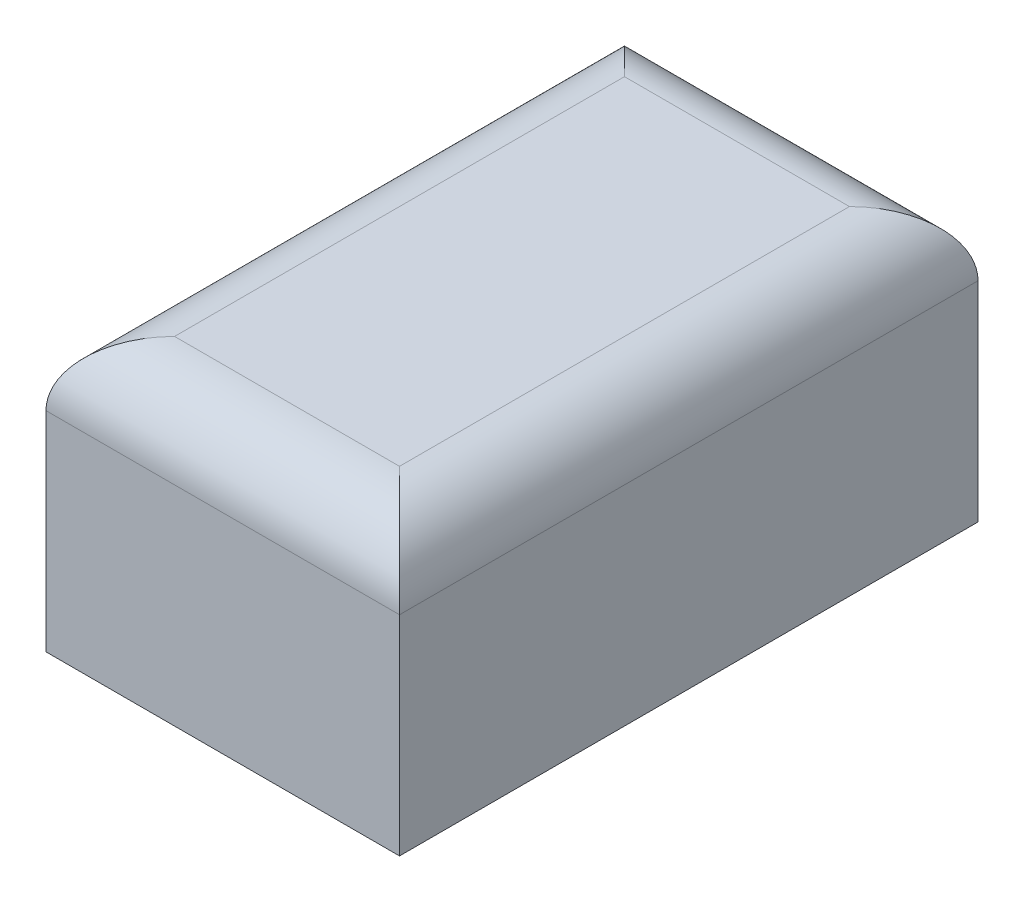
ISO-10303-21;
HEADER;
FILE_DESCRIPTION(('STEP AP214'),'2;1');
FILE_NAME('part.step','',(''),(''),'','','');
FILE_SCHEMA(('AUTOMOTIVE_DESIGN { 1 0 10303 214 1 1 1 1 }'));
ENDSEC;
DATA;
#1=APPLICATION_CONTEXT('core data for automotive mechanical design processes');
#2=APPLICATION_PROTOCOL_DEFINITION('international standard','automotive_design',2000,#1);
#3=PRODUCT_CONTEXT('',#1,'mechanical');
#4=PRODUCT('Part','Part','',(#3));
#5=PRODUCT_RELATED_PRODUCT_CATEGORY('part','',(#4));
#6=PRODUCT_DEFINITION_FORMATION('','',#4);
#7=PRODUCT_DEFINITION_CONTEXT('part definition',#1,'design');
#8=PRODUCT_DEFINITION('design','',#6,#7);
#9=PRODUCT_DEFINITION_SHAPE('','',#8);
#10=(LENGTH_UNIT() NAMED_UNIT(*) SI_UNIT(.MILLI.,.METRE.));
#11=(NAMED_UNIT(*) PLANE_ANGLE_UNIT() SI_UNIT($,.RADIAN.));
#12=(NAMED_UNIT(*) SI_UNIT($,.STERADIAN.) SOLID_ANGLE_UNIT());
#13=UNCERTAINTY_MEASURE_WITH_UNIT(LENGTH_MEASURE(1.E-05),#10,'distance_accuracy_value','');
#14=(GEOMETRIC_REPRESENTATION_CONTEXT(3) GLOBAL_UNCERTAINTY_ASSIGNED_CONTEXT((#13)) GLOBAL_UNIT_ASSIGNED_CONTEXT((#10,
#11,#12)) REPRESENTATION_CONTEXT('',''));
#15=CARTESIAN_POINT('',(0.,0.,0.));
#16=DIRECTION('',(0.,0.,1.));
#17=DIRECTION('',(1.,0.,0.));
#18=AXIS2_PLACEMENT_3D('',#15,#16,#17);
#19=CARTESIAN_POINT('',(11.,17.,18.));
#20=DIRECTION('',(-1.,0.,0.));
#21=DIRECTION('',(0.,0.,1.));
#22=AXIS2_PLACEMENT_3D('',#19,#20,#21);
#23=PLANE('',#22);
#24=DIRECTION('',(0.,-1.,0.));
#25=VECTOR('',#24,1.);
#26=CARTESIAN_POINT('',(11.,17.,-18.));
#27=LINE('',#26,#25);
#28=CARTESIAN_POINT('',(11.,13.,-18.));
#29=VERTEX_POINT('',#28);
#30=CARTESIAN_POINT('',(11.,0.,-18.));
#31=VERTEX_POINT('',#30);
#32=EDGE_CURVE('E171',#29,#31,#27,.T.);
#33=ORIENTED_EDGE('',*,*,#32,.F.);
#34=DIRECTION('',(0.,0.,-1.));
#35=VECTOR('',#34,1.);
#36=CARTESIAN_POINT('',(11.,13.,18.));
#37=LINE('',#36,#35);
#38=CARTESIAN_POINT('',(11.,13.,18.));
#39=VERTEX_POINT('',#38);
#40=EDGE_CURVE('E57',#29,#39,#37,.F.);
#41=ORIENTED_EDGE('',*,*,#40,.T.);
#42=DIRECTION('',(0.,-1.,0.));
#43=VECTOR('',#42,1.);
#44=CARTESIAN_POINT('',(11.,17.,18.));
#45=LINE('',#44,#43);
#46=CARTESIAN_POINT('',(11.,0.,18.));
#47=VERTEX_POINT('',#46);
#48=EDGE_CURVE('E165',#39,#47,#45,.T.);
#49=ORIENTED_EDGE('',*,*,#48,.T.);
#50=DIRECTION('',(0.,0.,-1.));
#51=VECTOR('',#50,1.);
#52=CARTESIAN_POINT('',(11.,0.,18.));
#53=LINE('',#52,#51);
#54=EDGE_CURVE('E150',#47,#31,#53,.T.);
#55=ORIENTED_EDGE('',*,*,#54,.T.);
#56=EDGE_LOOP('',(#33,#41,#49,#55));
#57=FACE_BOUND('',#56,.T.);
#58=ADVANCED_FACE('F33',(#57),#23,.F.);
#59=CARTESIAN_POINT('',(-11.,17.,-18.));
#60=DIRECTION('',(0.,0.,1.));
#61=DIRECTION('',(1.,0.,0.));
#62=AXIS2_PLACEMENT_3D('',#59,#60,#61);
#63=PLANE('',#62);
#64=DIRECTION('',(0.,-1.,0.));
#65=VECTOR('',#64,1.);
#66=CARTESIAN_POINT('',(-11.,17.,-18.));
#67=LINE('',#66,#65);
#68=CARTESIAN_POINT('',(-11.,13.,-18.));
#69=VERTEX_POINT('',#68);
#70=CARTESIAN_POINT('',(-11.,0.,-18.));
#71=VERTEX_POINT('',#70);
#72=EDGE_CURVE('E169',#69,#71,#67,.T.);
#73=ORIENTED_EDGE('',*,*,#72,.F.);
#74=DIRECTION('',(-1.,0.,0.));
#75=VECTOR('',#74,1.);
#76=CARTESIAN_POINT('',(-11.,13.,-18.));
#77=LINE('',#76,#75);
#78=EDGE_CURVE('E182',#69,#29,#77,.F.);
#79=ORIENTED_EDGE('',*,*,#78,.T.);
#80=ORIENTED_EDGE('',*,*,#32,.T.);
#81=DIRECTION('',(-1.,0.,0.));
#82=VECTOR('',#81,1.);
#83=CARTESIAN_POINT('',(-11.,0.,-18.));
#84=LINE('',#83,#82);
#85=EDGE_CURVE('E156',#31,#71,#84,.T.);
#86=ORIENTED_EDGE('',*,*,#85,.T.);
#87=EDGE_LOOP('',(#73,#79,#80,#86));
#88=FACE_BOUND('',#87,.T.);
#89=ADVANCED_FACE('F211',(#88),#63,.F.);
#90=CARTESIAN_POINT('',(-11.,17.,18.));
#91=DIRECTION('',(1.,0.,0.));
#92=DIRECTION('',(0.,0.,-1.));
#93=AXIS2_PLACEMENT_3D('',#90,#91,#92);
#94=PLANE('',#93);
#95=DIRECTION('',(0.,-1.,0.));
#96=VECTOR('',#95,1.);
#97=CARTESIAN_POINT('',(-11.,17.,18.));
#98=LINE('',#97,#96);
#99=CARTESIAN_POINT('',(-11.,13.,18.));
#100=VERTEX_POINT('',#99);
#101=CARTESIAN_POINT('',(-11.,0.,18.));
#102=VERTEX_POINT('',#101);
#103=EDGE_CURVE('E167',#100,#102,#98,.T.);
#104=ORIENTED_EDGE('',*,*,#103,.F.);
#105=DIRECTION('',(0.,0.,1.));
#106=VECTOR('',#105,1.);
#107=CARTESIAN_POINT('',(-11.,13.,18.));
#108=LINE('',#107,#106);
#109=EDGE_CURVE('E11',#100,#69,#108,.F.);
#110=ORIENTED_EDGE('',*,*,#109,.T.);
#111=ORIENTED_EDGE('',*,*,#72,.T.);
#112=DIRECTION('',(0.,0.,1.));
#113=VECTOR('',#112,1.);
#114=CARTESIAN_POINT('',(-11.,0.,18.));
#115=LINE('',#114,#113);
#116=EDGE_CURVE('E159',#71,#102,#115,.T.);
#117=ORIENTED_EDGE('',*,*,#116,.T.);
#118=EDGE_LOOP('',(#104,#110,#111,#117));
#119=FACE_BOUND('',#118,.T.);
#120=ADVANCED_FACE('F208',(#119),#94,.F.);
#121=CARTESIAN_POINT('',(-11.,17.,18.));
#122=DIRECTION('',(0.,0.,-1.));
#123=DIRECTION('',(-1.,0.,0.));
#124=AXIS2_PLACEMENT_3D('',#121,#122,#123);
#125=PLANE('',#124);
#126=ORIENTED_EDGE('',*,*,#48,.F.);
#127=DIRECTION('',(1.,0.,0.));
#128=VECTOR('',#127,1.);
#129=CARTESIAN_POINT('',(-11.,13.,18.));
#130=LINE('',#129,#128);
#131=EDGE_CURVE('E42',#39,#100,#130,.F.);
#132=ORIENTED_EDGE('',*,*,#131,.T.);
#133=ORIENTED_EDGE('',*,*,#103,.T.);
#134=DIRECTION('',(1.,0.,0.));
#135=VECTOR('',#134,1.);
#136=CARTESIAN_POINT('',(-11.,0.,18.));
#137=LINE('',#136,#135);
#138=EDGE_CURVE('E162',#102,#47,#137,.T.);
#139=ORIENTED_EDGE('',*,*,#138,.T.);
#140=EDGE_LOOP('',(#126,#132,#133,#139));
#141=FACE_BOUND('',#140,.T.);
#142=ADVANCED_FACE('F221',(#141),#125,.F.);
#143=CARTESIAN_POINT('',(0.,17.,0.));
#144=DIRECTION('',(0.,-1.,0.));
#145=DIRECTION('',(0.,0.,-1.));
#146=AXIS2_PLACEMENT_3D('',#143,#144,#145);
#147=PLANE('',#146);
#148=DIRECTION('',(0.,0.,-1.));
#149=VECTOR('',#148,1.);
#150=CARTESIAN_POINT('',(7.,17.,0.));
#151=LINE('',#150,#149);
#152=CARTESIAN_POINT('',(7.,17.,14.));
#153=VERTEX_POINT('',#152);
#154=CARTESIAN_POINT('',(7.,17.,-14.));
#155=VERTEX_POINT('',#154);
#156=EDGE_CURVE('E177',#153,#155,#151,.T.);
#157=ORIENTED_EDGE('',*,*,#156,.T.);
#158=DIRECTION('',(-1.,0.,0.));
#159=VECTOR('',#158,1.);
#160=CARTESIAN_POINT('',(0.,17.,-14.));
#161=LINE('',#160,#159);
#162=CARTESIAN_POINT('',(-7.,17.,-14.));
#163=VERTEX_POINT('',#162);
#164=EDGE_CURVE('E179',#155,#163,#161,.T.);
#165=ORIENTED_EDGE('',*,*,#164,.T.);
#166=DIRECTION('',(0.,0.,1.));
#167=VECTOR('',#166,1.);
#168=CARTESIAN_POINT('',(-7.,17.,0.));
#169=LINE('',#168,#167);
#170=CARTESIAN_POINT('',(-7.,17.,14.));
#171=VERTEX_POINT('',#170);
#172=EDGE_CURVE('E173',#163,#171,#169,.T.);
#173=ORIENTED_EDGE('',*,*,#172,.T.);
#174=DIRECTION('',(1.,0.,0.));
#175=VECTOR('',#174,1.);
#176=CARTESIAN_POINT('',(0.,17.,14.));
#177=LINE('',#176,#175);
#178=EDGE_CURVE('E175',#171,#153,#177,.T.);
#179=ORIENTED_EDGE('',*,*,#178,.T.);
#180=EDGE_LOOP('',(#157,#165,#173,#179));
#181=FACE_BOUND('',#180,.T.);
#182=ADVANCED_FACE('F218',(#181),#147,.F.);
#183=CARTESIAN_POINT('',(0.,0.,0.));
#184=DIRECTION('',(0.,-1.,0.));
#185=DIRECTION('',(0.,0.,-1.));
#186=AXIS2_PLACEMENT_3D('',#183,#184,#185);
#187=PLANE('',#186);
#188=DIRECTION('',(0.,0.,1.));
#189=VECTOR('',#188,1.);
#190=CARTESIAN_POINT('',(8.00000000000002,0.,-15.));
#191=LINE('',#190,#189);
#192=CARTESIAN_POINT('',(8.00000000000002,0.,-15.));
#193=VERTEX_POINT('',#192);
#194=CARTESIAN_POINT('',(8.00000000000002,0.,15.));
#195=VERTEX_POINT('',#194);
#196=EDGE_CURVE('E118',#193,#195,#191,.T.);
#197=ORIENTED_EDGE('',*,*,#196,.F.);
#198=DIRECTION('',(1.,0.,0.));
#199=VECTOR('',#198,1.);
#200=CARTESIAN_POINT('',(-7.99999999999999,0.,-15.));
#201=LINE('',#200,#199);
#202=CARTESIAN_POINT('',(-7.99999999999999,0.,-15.));
#203=VERTEX_POINT('',#202);
#204=EDGE_CURVE('E135',#203,#193,#201,.T.);
#205=ORIENTED_EDGE('',*,*,#204,.F.);
#206=DIRECTION('',(0.,0.,-1.));
#207=VECTOR('',#206,1.);
#208=CARTESIAN_POINT('',(-7.99999999999999,0.,-15.));
#209=LINE('',#208,#207);
#210=CARTESIAN_POINT('',(-7.99999999999999,0.,15.));
#211=VERTEX_POINT('',#210);
#212=EDGE_CURVE('E138',#211,#203,#209,.T.);
#213=ORIENTED_EDGE('',*,*,#212,.F.);
#214=DIRECTION('',(-1.,0.,0.));
#215=VECTOR('',#214,1.);
#216=CARTESIAN_POINT('',(-7.99999999999999,0.,15.));
#217=LINE('',#216,#215);
#218=EDGE_CURVE('E144',#195,#211,#217,.T.);
#219=ORIENTED_EDGE('',*,*,#218,.F.);
#220=EDGE_LOOP('',(#197,#205,#213,#219));
#221=FACE_BOUND('',#220,.T.);
#222=ORIENTED_EDGE('',*,*,#54,.F.);
#223=ORIENTED_EDGE('',*,*,#138,.F.);
#224=ORIENTED_EDGE('',*,*,#116,.F.);
#225=ORIENTED_EDGE('',*,*,#85,.F.);
#226=EDGE_LOOP('',(#222,#223,#224,#225));
#227=FACE_BOUND('',#226,.T.);
#228=ADVANCED_FACE('F220',(#221,#227),#187,.T.);
#229=CARTESIAN_POINT('',(8.00000000000002,14.,-15.));
#230=DIRECTION('',(1.,0.,0.));
#231=DIRECTION('',(0.,0.,-1.));
#232=AXIS2_PLACEMENT_3D('',#229,#230,#231);
#233=PLANE('',#232);
#234=ORIENTED_EDGE('',*,*,#196,.T.);
#235=DIRECTION('',(0.,-1.,0.));
#236=VECTOR('',#235,1.);
#237=CARTESIAN_POINT('',(8.00000000000002,14.,15.));
#238=LINE('',#237,#236);
#239=CARTESIAN_POINT('',(8.00000000000002,14.,15.));
#240=VERTEX_POINT('',#239);
#241=EDGE_CURVE('E111',#240,#195,#238,.T.);
#242=ORIENTED_EDGE('',*,*,#241,.F.);
#243=DIRECTION('',(0.,0.,1.));
#244=VECTOR('',#243,1.);
#245=CARTESIAN_POINT('',(8.00000000000002,14.,-15.));
#246=LINE('',#245,#244);
#247=CARTESIAN_POINT('',(8.00000000000002,14.,-15.));
#248=VERTEX_POINT('',#247);
#249=EDGE_CURVE('E115',#248,#240,#246,.T.);
#250=ORIENTED_EDGE('',*,*,#249,.F.);
#251=DIRECTION('',(0.,-1.,0.));
#252=VECTOR('',#251,1.);
#253=CARTESIAN_POINT('',(8.00000000000002,14.,-15.));
#254=LINE('',#253,#252);
#255=EDGE_CURVE('E148',#248,#193,#254,.T.);
#256=ORIENTED_EDGE('',*,*,#255,.T.);
#257=EDGE_LOOP('',(#234,#242,#250,#256));
#258=FACE_BOUND('',#257,.T.);
#259=ADVANCED_FACE('F113',(#258),#233,.F.);
#260=CARTESIAN_POINT('',(-7.99999999999999,14.,-15.));
#261=DIRECTION('',(0.,0.,-1.));
#262=DIRECTION('',(-1.,0.,0.));
#263=AXIS2_PLACEMENT_3D('',#260,#261,#262);
#264=PLANE('',#263);
#265=ORIENTED_EDGE('',*,*,#204,.T.);
#266=ORIENTED_EDGE('',*,*,#255,.F.);
#267=DIRECTION('',(1.,0.,0.));
#268=VECTOR('',#267,1.);
#269=CARTESIAN_POINT('',(-7.99999999999999,14.,-15.));
#270=LINE('',#269,#268);
#271=CARTESIAN_POINT('',(-7.99999999999999,14.,-15.));
#272=VERTEX_POINT('',#271);
#273=EDGE_CURVE('E123',#272,#248,#270,.T.);
#274=ORIENTED_EDGE('',*,*,#273,.F.);
#275=DIRECTION('',(0.,-1.,0.));
#276=VECTOR('',#275,1.);
#277=CARTESIAN_POINT('',(-7.99999999999999,14.,-15.));
#278=LINE('',#277,#276);
#279=EDGE_CURVE('E151',#272,#203,#278,.T.);
#280=ORIENTED_EDGE('',*,*,#279,.T.);
#281=EDGE_LOOP('',(#265,#266,#274,#280));
#282=FACE_BOUND('',#281,.T.);
#283=ADVANCED_FACE('F256',(#282),#264,.F.);
#284=CARTESIAN_POINT('',(-7.99999999999999,14.,-15.));
#285=DIRECTION('',(-1.,0.,0.));
#286=DIRECTION('',(0.,0.,1.));
#287=AXIS2_PLACEMENT_3D('',#284,#285,#286);
#288=PLANE('',#287);
#289=ORIENTED_EDGE('',*,*,#212,.T.);
#290=ORIENTED_EDGE('',*,*,#279,.F.);
#291=DIRECTION('',(0.,0.,-1.));
#292=VECTOR('',#291,1.);
#293=CARTESIAN_POINT('',(-7.99999999999999,14.,-15.));
#294=LINE('',#293,#292);
#295=CARTESIAN_POINT('',(-7.99999999999999,14.,15.));
#296=VERTEX_POINT('',#295);
#297=EDGE_CURVE('E131',#296,#272,#294,.T.);
#298=ORIENTED_EDGE('',*,*,#297,.F.);
#299=DIRECTION('',(0.,-1.,0.));
#300=VECTOR('',#299,1.);
#301=CARTESIAN_POINT('',(-7.99999999999999,14.,15.));
#302=LINE('',#301,#300);
#303=EDGE_CURVE('E122',#296,#211,#302,.T.);
#304=ORIENTED_EDGE('',*,*,#303,.T.);
#305=EDGE_LOOP('',(#289,#290,#298,#304));
#306=FACE_BOUND('',#305,.T.);
#307=ADVANCED_FACE('F253',(#306),#288,.F.);
#308=CARTESIAN_POINT('',(-7.99999999999999,14.,15.));
#309=DIRECTION('',(0.,0.,1.));
#310=DIRECTION('',(1.,0.,0.));
#311=AXIS2_PLACEMENT_3D('',#308,#309,#310);
#312=PLANE('',#311);
#313=ORIENTED_EDGE('',*,*,#218,.T.);
#314=ORIENTED_EDGE('',*,*,#303,.F.);
#315=DIRECTION('',(-1.,0.,0.));
#316=VECTOR('',#315,1.);
#317=CARTESIAN_POINT('',(-7.99999999999999,14.,15.));
#318=LINE('',#317,#316);
#319=EDGE_CURVE('E126',#240,#296,#318,.T.);
#320=ORIENTED_EDGE('',*,*,#319,.F.);
#321=ORIENTED_EDGE('',*,*,#241,.T.);
#322=EDGE_LOOP('',(#313,#314,#320,#321));
#323=FACE_BOUND('',#322,.T.);
#324=ADVANCED_FACE('F127',(#323),#312,.F.);
#325=CARTESIAN_POINT('',(0.,14.,0.));
#326=DIRECTION('',(0.,1.,0.));
#327=DIRECTION('',(0.,0.,1.));
#328=AXIS2_PLACEMENT_3D('',#325,#326,#327);
#329=PLANE('',#328);
#330=ORIENTED_EDGE('',*,*,#249,.T.);
#331=ORIENTED_EDGE('',*,*,#319,.T.);
#332=ORIENTED_EDGE('',*,*,#297,.T.);
#333=ORIENTED_EDGE('',*,*,#273,.T.);
#334=EDGE_LOOP('',(#330,#331,#332,#333));
#335=FACE_BOUND('',#334,.T.);
#336=ADVANCED_FACE('F133',(#335),#329,.F.);
#337=CARTESIAN_POINT('',(0.,13.,14.));
#338=DIRECTION('',(1.,0.,0.));
#339=DIRECTION('',(0.,0.,-1.));
#340=AXIS2_PLACEMENT_3D('',#337,#338,#339);
#341=CYLINDRICAL_SURFACE('',#340,4.);
#342=CARTESIAN_POINT('',(-7.,13.,14.));
#343=DIRECTION('',(0.707106781186547,0.,0.707106781186547));
#344=DIRECTION('',(-0.707106781186547,0.,0.707106781186547));
#345=AXIS2_PLACEMENT_3D('',#342,#343,#344);
#346=ELLIPSE('',#345,5.65685424949238,4.);
#347=EDGE_CURVE('E190',#100,#171,#346,.F.);
#348=ORIENTED_EDGE('',*,*,#347,.F.);
#349=ORIENTED_EDGE('',*,*,#131,.F.);
#350=CARTESIAN_POINT('',(7.,13.,14.));
#351=DIRECTION('',(0.707106781186547,0.,-0.707106781186547));
#352=DIRECTION('',(0.707106781186547,0.,0.707106781186547));
#353=AXIS2_PLACEMENT_3D('',#350,#351,#352);
#354=ELLIPSE('',#353,5.65685424949238,4.);
#355=EDGE_CURVE('E37',#153,#39,#354,.T.);
#356=ORIENTED_EDGE('',*,*,#355,.F.);
#357=ORIENTED_EDGE('',*,*,#178,.F.);
#358=EDGE_LOOP('',(#348,#349,#356,#357));
#359=FACE_BOUND('',#358,.T.);
#360=ADVANCED_FACE('F35',(#359),#341,.T.);
#361=CARTESIAN_POINT('',(7.,13.,0.));
#362=DIRECTION('',(0.,0.,-1.));
#363=DIRECTION('',(-1.,0.,0.));
#364=AXIS2_PLACEMENT_3D('',#361,#362,#363);
#365=CYLINDRICAL_SURFACE('',#364,4.);
#366=ORIENTED_EDGE('',*,*,#355,.T.);
#367=ORIENTED_EDGE('',*,*,#40,.F.);
#368=CARTESIAN_POINT('',(7.,13.,-14.));
#369=DIRECTION('',(-0.707106781186547,0.,-0.707106781186547));
#370=DIRECTION('',(0.707106781186547,0.,-0.707106781186547));
#371=AXIS2_PLACEMENT_3D('',#368,#369,#370);
#372=ELLIPSE('',#371,5.65685424949238,4.);
#373=EDGE_CURVE('E189',#155,#29,#372,.T.);
#374=ORIENTED_EDGE('',*,*,#373,.F.);
#375=ORIENTED_EDGE('',*,*,#156,.F.);
#376=EDGE_LOOP('',(#366,#367,#374,#375));
#377=FACE_BOUND('',#376,.T.);
#378=ADVANCED_FACE('F200',(#377),#365,.T.);
#379=CARTESIAN_POINT('',(-7.,13.,0.));
#380=DIRECTION('',(0.,0.,1.));
#381=DIRECTION('',(1.,0.,0.));
#382=AXIS2_PLACEMENT_3D('',#379,#380,#381);
#383=CYLINDRICAL_SURFACE('',#382,4.);
#384=ORIENTED_EDGE('',*,*,#347,.T.);
#385=ORIENTED_EDGE('',*,*,#172,.F.);
#386=CARTESIAN_POINT('',(-7.,13.,-14.));
#387=DIRECTION('',(-0.707106781186547,0.,0.707106781186547));
#388=DIRECTION('',(0.707106781186547,0.,0.707106781186547));
#389=AXIS2_PLACEMENT_3D('',#386,#387,#388);
#390=ELLIPSE('',#389,5.65685424949238,4.);
#391=EDGE_CURVE('E187',#69,#163,#390,.F.);
#392=ORIENTED_EDGE('',*,*,#391,.F.);
#393=ORIENTED_EDGE('',*,*,#109,.F.);
#394=EDGE_LOOP('',(#384,#385,#392,#393));
#395=FACE_BOUND('',#394,.T.);
#396=ADVANCED_FACE('F205',(#395),#383,.T.);
#397=CARTESIAN_POINT('',(0.,13.,-14.));
#398=DIRECTION('',(-1.,0.,0.));
#399=DIRECTION('',(0.,0.,1.));
#400=AXIS2_PLACEMENT_3D('',#397,#398,#399);
#401=CYLINDRICAL_SURFACE('',#400,4.);
#402=ORIENTED_EDGE('',*,*,#373,.T.);
#403=ORIENTED_EDGE('',*,*,#78,.F.);
#404=ORIENTED_EDGE('',*,*,#391,.T.);
#405=ORIENTED_EDGE('',*,*,#164,.F.);
#406=EDGE_LOOP('',(#402,#403,#404,#405));
#407=FACE_BOUND('',#406,.T.);
#408=ADVANCED_FACE('F215',(#407),#401,.T.);
#409=CLOSED_SHELL('',(#58,#89,#120,#142,#182,#228,#259,#283,#307,#324,#336,#360,#378,#396,#408));
#410=MANIFOLD_SOLID_BREP('B2',#409);
#411=ADVANCED_BREP_SHAPE_REPRESENTATION('',(#18,#410),#14);
#412=SHAPE_DEFINITION_REPRESENTATION(#9,#411);
ENDSEC;
END-ISO-10303-21;
